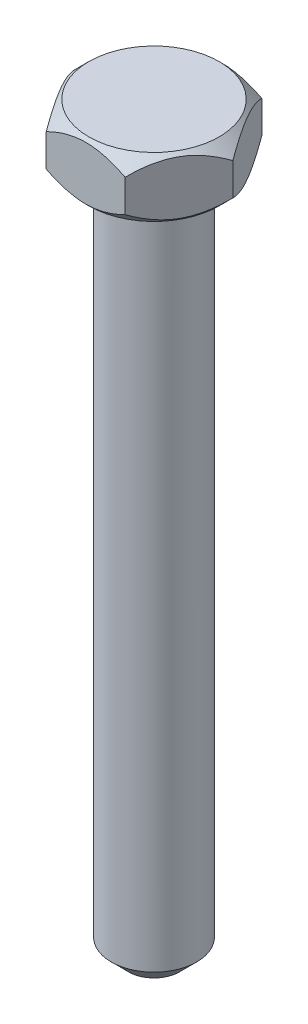
ISO-10303-21;
HEADER;
FILE_DESCRIPTION(('STEP AP214'),'2;1');
FILE_NAME('part.step','',(''),(''),'','','');
FILE_SCHEMA(('AUTOMOTIVE_DESIGN { 1 0 10303 214 1 1 1 1 }'));
ENDSEC;
DATA;
#1=APPLICATION_CONTEXT('core data for automotive mechanical design processes');
#2=APPLICATION_PROTOCOL_DEFINITION('international standard','automotive_design',2000,#1);
#3=PRODUCT_CONTEXT('',#1,'mechanical');
#4=PRODUCT('Part','Part','',(#3));
#5=PRODUCT_RELATED_PRODUCT_CATEGORY('part','',(#4));
#6=PRODUCT_DEFINITION_FORMATION('','',#4);
#7=PRODUCT_DEFINITION_CONTEXT('part definition',#1,'design');
#8=PRODUCT_DEFINITION('design','',#6,#7);
#9=PRODUCT_DEFINITION_SHAPE('','',#8);
#10=(LENGTH_UNIT() NAMED_UNIT(*) SI_UNIT(.MILLI.,.METRE.));
#11=(NAMED_UNIT(*) PLANE_ANGLE_UNIT() SI_UNIT($,.RADIAN.));
#12=(NAMED_UNIT(*) SI_UNIT($,.STERADIAN.) SOLID_ANGLE_UNIT());
#13=UNCERTAINTY_MEASURE_WITH_UNIT(LENGTH_MEASURE(1.E-05),#10,'distance_accuracy_value','');
#14=(GEOMETRIC_REPRESENTATION_CONTEXT(3) GLOBAL_UNCERTAINTY_ASSIGNED_CONTEXT((#13)) GLOBAL_UNIT_ASSIGNED_CONTEXT((#10,
#11,#12)) REPRESENTATION_CONTEXT('',''));
#15=CARTESIAN_POINT('',(0.,0.,0.));
#16=DIRECTION('',(0.,0.,1.));
#17=DIRECTION('',(1.,0.,0.));
#18=AXIS2_PLACEMENT_3D('',#15,#16,#17);
#19=CARTESIAN_POINT('',(-4.61880215351701,-3.5,0.));
#20=DIRECTION('',(0.,1.,0.));
#21=DIRECTION('',(0.,0.,1.));
#22=AXIS2_PLACEMENT_3D('',#19,#20,#21);
#23=PLANE('',#22);
#24=CARTESIAN_POINT('',(0.,-3.5,0.));
#25=DIRECTION('',(0.,1.,0.));
#26=DIRECTION('',(0.,0.,1.));
#27=AXIS2_PLACEMENT_3D('',#24,#25,#26);
#28=CIRCLE('',#27,3.81880215351701);
#29=CARTESIAN_POINT('',(0.,-3.5,3.81880215351701));
#30=VERTEX_POINT('',#29);
#31=EDGE_CURVE('E102',#30,#30,#28,.T.);
#32=ORIENTED_EDGE('',*,*,#31,.F.);
#33=EDGE_LOOP('',(#32));
#34=FACE_BOUND('',#33,.T.);
#35=CARTESIAN_POINT('',(0.,-3.5,0.));
#36=DIRECTION('',(0.,1.,0.));
#37=DIRECTION('',(0.,0.,1.));
#38=AXIS2_PLACEMENT_3D('',#35,#36,#37);
#39=CIRCLE('',#38,2.5);
#40=CARTESIAN_POINT('',(0.,-3.5,2.5));
#41=VERTEX_POINT('',#40);
#42=EDGE_CURVE('E117',#41,#41,#39,.F.);
#43=ORIENTED_EDGE('',*,*,#42,.F.);
#44=EDGE_LOOP('',(#43));
#45=FACE_BOUND('',#44,.T.);
#46=ADVANCED_FACE('F29',(#34,#45),#23,.F.);
#47=CARTESIAN_POINT('',(0.,-43.5,0.));
#48=DIRECTION('',(0.,1.,0.));
#49=DIRECTION('',(0.,0.,1.));
#50=AXIS2_PLACEMENT_3D('',#47,#48,#49);
#51=CYLINDRICAL_SURFACE('',#50,2.5);
#52=CARTESIAN_POINT('',(0.,-42.5,0.));
#53=DIRECTION('',(0.,-1.,0.));
#54=DIRECTION('',(0.,0.,-1.));
#55=AXIS2_PLACEMENT_3D('',#52,#53,#54);
#56=CIRCLE('',#55,2.5);
#57=CARTESIAN_POINT('',(0.,-42.5,-2.5));
#58=VERTEX_POINT('',#57);
#59=EDGE_CURVE('E42',#58,#58,#56,.F.);
#60=ORIENTED_EDGE('',*,*,#59,.T.);
#61=EDGE_LOOP('',(#60));
#62=FACE_BOUND('',#61,.T.);
#63=ORIENTED_EDGE('',*,*,#42,.T.);
#64=EDGE_LOOP('',(#63));
#65=FACE_BOUND('',#64,.T.);
#66=ADVANCED_FACE('F126',(#62,#65),#51,.T.);
#67=CARTESIAN_POINT('',(0.,-43.5,0.));
#68=DIRECTION('',(0.,-1.,0.));
#69=DIRECTION('',(0.,0.,-1.));
#70=AXIS2_PLACEMENT_3D('',#67,#68,#69);
#71=PLANE('',#70);
#72=CARTESIAN_POINT('',(0.,-43.5,0.));
#73=DIRECTION('',(0.,-1.,0.));
#74=DIRECTION('',(0.,0.,-1.));
#75=AXIS2_PLACEMENT_3D('',#72,#73,#74);
#76=CIRCLE('',#75,1.5);
#77=CARTESIAN_POINT('',(0.,-43.5,-1.5));
#78=VERTEX_POINT('',#77);
#79=EDGE_CURVE('E120',#78,#78,#76,.T.);
#80=ORIENTED_EDGE('',*,*,#79,.T.);
#81=EDGE_LOOP('',(#80));
#82=FACE_BOUND('',#81,.T.);
#83=ADVANCED_FACE('F132',(#82),#71,.T.);
#84=CARTESIAN_POINT('',(0.,-43.5,0.));
#85=DIRECTION('',(0.,1.,0.));
#86=DIRECTION('',(0.,0.,1.));
#87=AXIS2_PLACEMENT_3D('',#84,#85,#86);
#88=CONICAL_SURFACE('',#87,1.5,0.785398163397444);
#89=ORIENTED_EDGE('',*,*,#59,.F.);
#90=EDGE_LOOP('',(#89));
#91=FACE_BOUND('',#90,.T.);
#92=ORIENTED_EDGE('',*,*,#79,.F.);
#93=EDGE_LOOP('',(#92));
#94=FACE_BOUND('',#93,.T.);
#95=ADVANCED_FACE('F129',(#91,#94),#88,.T.);
#96=CARTESIAN_POINT('',(0.,-3.5,0.));
#97=DIRECTION('',(0.,1.,0.));
#98=DIRECTION('',(0.,0.,1.));
#99=AXIS2_PLACEMENT_3D('',#96,#97,#98);
#100=CONICAL_SURFACE('',#99,3.81880215351701,0.785398163397448);
#101=CARTESIAN_POINT('',(-4.61891762357085,-2.69988452561614,0.000200000000027756));
#102=CARTESIAN_POINT('',(-4.57920690352857,-2.73959114404244,-0.068580984718356));
#103=CARTESIAN_POINT('',(-4.53919230356692,-2.77807958288685,-0.137888304896475));
#104=CARTESIAN_POINT('',(-4.45849274714728,-2.8522487762645,-0.277664036763568));
#105=CARTESIAN_POINT('',(-4.41780743901014,-2.88792799726836,-0.348133057578679));
#106=CARTESIAN_POINT('',(-4.29427352009149,-2.99049913234901,-0.562100081603879));
#107=CARTESIAN_POINT('',(-4.21037499527408,-3.05248688898744,-0.707416589267722));
#108=CARTESIAN_POINT('',(-4.04121970302445,-3.1586441309906,-1.00040214981323));
#109=CARTESIAN_POINT('',(-3.95600566300933,-3.20308094454657,-1.14799719663762));
#110=CARTESIAN_POINT('',(-3.78369592639709,-3.27155101787056,-1.44644641508885));
#111=CARTESIAN_POINT('',(-3.6966055069617,-3.29563536213871,-1.59729144640342));
#112=CARTESIAN_POINT('',(-3.54650860589272,-3.31736511913948,-1.85726690511355));
#113=CARTESIAN_POINT('',(-3.48369550790706,-3.32058108535916,-1.96606238220551));
#114=CARTESIAN_POINT('',(-3.35817126167379,-3.31515994177501,-2.18347675426331));
#115=CARTESIAN_POINT('',(-3.29546015687919,-3.30651867682818,-2.29209557396634));
#116=CARTESIAN_POINT('',(-3.17063214810082,-3.27787596150358,-2.50830402737814));
#117=CARTESIAN_POINT('',(-3.10851598784037,-3.25786180544875,-2.61589237292032));
#118=CARTESIAN_POINT('',(-2.98535047827865,-3.20756584263536,-2.82922129322133));
#119=CARTESIAN_POINT('',(-2.92430104755975,-3.17728482312165,-2.93496200899963));
#120=CARTESIAN_POINT('',(-2.81592361944285,-3.11498474730579,-3.12267722089175));
#121=CARTESIAN_POINT('',(-2.76835567444983,-3.08460372013991,-3.2050673184313));
#122=CARTESIAN_POINT('',(-2.67407371522763,-3.01894553543967,-3.36836846204128));
#123=CARTESIAN_POINT('',(-2.6273597270248,-2.98366822896023,-3.44927946303275));
#124=CARTESIAN_POINT('',(-2.53493285809128,-2.90900831297909,-3.60936749601013));
#125=CARTESIAN_POINT('',(-2.48921734857499,-2.86963861299641,-3.68854908118623));
#126=CARTESIAN_POINT('',(-2.39863292742736,-2.78731089185671,-3.84544590098815));
#127=CARTESIAN_POINT('',(-2.35376351682289,-2.74435507219806,-3.92316199986076));
#128=CARTESIAN_POINT('',(-2.30928560670467,-2.69988452561615,-4.0002));
#129=B_SPLINE_CURVE_WITH_KNOTS('',3,(#101,#102,#103,#104,#105,#106,#107,#108,#109,#110,#111,
#112,#113,#114,#115,#116,#117,#118,#119,#120,#121,#122,#123,#124,#125,#126,#127,#128),
.UNSPECIFIED.,.F.,.F.,(4,2,2,2,2,2,2,2,2,2,2,2,2,4),(0.,0.266361961703665,0.532868334400115,
1.06875865685463,1.59613884594052,2.12219135055581,2.49866160599659,2.87526382203495,
3.25228760372077,3.62928248242858,3.92874944437162,4.22822551811347,4.52678401907576,
4.82516056577924),.UNSPECIFIED.);
#130=CARTESIAN_POINT('',(-4.61880215351702,-2.7,0.));
#131=VERTEX_POINT('',#130);
#132=CARTESIAN_POINT('',(-2.30940107675852,-2.7,-4.));
#133=VERTEX_POINT('',#132);
#134=EDGE_CURVE('E177',#131,#133,#129,.T.);
#135=ORIENTED_EDGE('',*,*,#134,.T.);
#136=CARTESIAN_POINT('',(-4.74669494328341,-1.11145868915222,-4.));
#137=CARTESIAN_POINT('',(-4.63173073558873,-1.1993508654303,-4.));
#138=CARTESIAN_POINT('',(-4.51613887537967,-1.28643511858206,-4.));
#139=CARTESIAN_POINT('',(-4.28344630120931,-1.45862113364621,-4.));
#140=CARTESIAN_POINT('',(-4.16634522978712,-1.54372241196675,-4.));
#141=CARTESIAN_POINT('',(-3.92952428886011,-1.71218153620796,-4.));
#142=CARTESIAN_POINT('',(-3.80979117395059,-1.79552082328341,-4.));
#143=CARTESIAN_POINT('',(-3.56831834415258,-1.95922999490112,-4.));
#144=CARTESIAN_POINT('',(-3.44657876940923,-2.03960008557233,-4.));
#145=CARTESIAN_POINT('',(-3.19323146896135,-2.20151222850148,-4.));
#146=CARTESIAN_POINT('',(-3.06147610302173,-2.28282442900108,-4.));
#147=CARTESIAN_POINT('',(-2.79487655444763,-2.44030225958758,-4.));
#148=CARTESIAN_POINT('',(-2.6600318671341,-2.51646704063563,-4.));
#149=CARTESIAN_POINT('',(-2.38723344772492,-2.66202065614541,-4.));
#150=CARTESIAN_POINT('',(-2.24929042181595,-2.73142939927244,-4.));
#151=CARTESIAN_POINT('',(-1.96955020070889,-2.86191616592764,-4.));
#152=CARTESIAN_POINT('',(-1.82775483658784,-2.92299806703933,-4.));
#153=CARTESIAN_POINT('',(-1.55337254847197,-3.02945404139103,-4.));
#154=CARTESIAN_POINT('',(-1.4211506740557,-3.07575938281105,-4.));
#155=CARTESIAN_POINT('',(-1.153400475509,-3.15777962167409,-4.));
#156=CARTESIAN_POINT('',(-1.01787193595579,-3.19349382712074,-4.));
#157=CARTESIAN_POINT('',(-0.746641513502644,-3.25182748471192,-4.));
#158=CARTESIAN_POINT('',(-0.610990636137922,-3.27468015045871,-4.));
#159=CARTESIAN_POINT('',(-0.338082766934168,-3.30682458453426,-4.));
#160=CARTESIAN_POINT('',(-0.200826093272512,-3.31611899495528,-4.));
#161=CARTESIAN_POINT('',(0.0682725110831627,-3.32038918600646,-4.));
#162=CARTESIAN_POINT('',(0.200105501326917,-3.31593690851227,-4.));
#163=CARTESIAN_POINT('',(0.462709681486531,-3.29425661019797,-4.));
#164=CARTESIAN_POINT('',(0.593480771402084,-3.27702739994749,-4.));
#165=CARTESIAN_POINT('',(0.855228740743153,-3.23046292068837,-4.));
#166=CARTESIAN_POINT('',(0.986167438767936,-3.20091656435704,-4.));
#167=CARTESIAN_POINT('',(1.24517252052895,-3.13133537173076,-4.));
#168=CARTESIAN_POINT('',(1.37323909358621,-3.09130122897531,-4.));
#169=CARTESIAN_POINT('',(1.6350146777751,-2.99940176499948,-4.));
#170=CARTESIAN_POINT('',(1.76850120421469,-2.94690960373252,-4.));
#171=CARTESIAN_POINT('',(2.03203083305245,-2.83383048639002,-4.));
#172=CARTESIAN_POINT('',(2.16207233412168,-2.77323984239489,-4.));
#173=CARTESIAN_POINT('',(2.41933252641898,-2.64540192173417,-4.));
#174=CARTESIAN_POINT('',(2.54654088208384,-2.57813401413965,-4.));
#175=CARTESIAN_POINT('',(2.79803896567839,-2.43842389721416,-4.));
#176=CARTESIAN_POINT('',(2.9223291435755,-2.36598249266423,-4.));
#177=CARTESIAN_POINT('',(3.16228713945874,-2.22062527401129,-4.));
#178=CARTESIAN_POINT('',(3.27807727928803,-2.14791032425798,-4.));
#179=CARTESIAN_POINT('',(3.5076685919422,-1.99939622591037,-4.));
#180=CARTESIAN_POINT('',(3.62146961421383,-1.92359684529293,-4.));
#181=CARTESIAN_POINT('',(3.84642549416774,-1.77008416558951,-4.));
#182=CARTESIAN_POINT('',(3.95759428564676,-1.69239121161213,-4.));
#183=CARTESIAN_POINT('',(4.17840845706007,-1.53493086471948,-4.));
#184=CARTESIAN_POINT('',(4.28805424827146,-1.4551640492307,-4.));
#185=CARTESIAN_POINT('',(4.39706149639085,-1.37454864251642,-4.));
#186=B_SPLINE_CURVE_WITH_KNOTS('',3,(#136,#137,#138,#139,#140,#141,#142,#143,#144,#145,#146,
#147,#148,#149,#150,#151,#152,#153,#154,#155,#156,#157,#158,#159,#160,#161,#162,#163,#164,#165,
#166,#167,#168,#169,#170,#171,#172,#173,#174,#175,#176,#177,#178,#179,#180,#181,#182,#183,#184,
#185),.UNSPECIFIED.,.F.,.F.,(4,2,2,2,2,2,2,2,2,2,2,2,2,2,2,2,2,2,2,2,2,2,2,2,4),(0.,
0.434146668569334,0.868398128074756,1.30600593465858,1.74358330412151,2.20796839055966,
2.672429888782,3.13547841811301,3.59831057635038,4.01823322720891,4.43818330864351,
4.85025065344053,5.26223768809276,5.65731799923051,6.05243509380702,6.45462166461373,
6.85678164621651,7.28676033389218,7.71693549838636,8.1484838030882,8.57996512242888,
8.9900948031474,9.4002553926905,9.80711077786197,10.2138540702172),.UNSPECIFIED.);
#187=CARTESIAN_POINT('',(2.3094010767585,-2.7,-4.00000000000002));
#188=VERTEX_POINT('',#187);
#189=EDGE_CURVE('E171',#133,#188,#186,.T.);
#190=ORIENTED_EDGE('',*,*,#189,.T.);
#191=CARTESIAN_POINT('',(2.30928560670467,-2.69988452561615,-4.0002));
#192=CARTESIAN_POINT('',(2.34899632674695,-2.73959114404245,-3.93141901528162));
#193=CARTESIAN_POINT('',(2.3890109267086,-2.77807958288686,-3.8621116951035));
#194=CARTESIAN_POINT('',(2.46971048312824,-2.8522487762645,-3.72233596323641));
#195=CARTESIAN_POINT('',(2.51039579126538,-2.88792799726837,-3.6518669424213));
#196=CARTESIAN_POINT('',(2.63392971018403,-2.99049913234902,-3.4378999183961));
#197=CARTESIAN_POINT('',(2.71782823500144,-3.05248688898745,-3.29258341073225));
#198=CARTESIAN_POINT('',(2.88698352725107,-3.15864413099061,-2.99959785018675));
#199=CARTESIAN_POINT('',(2.97219756726618,-3.20308094454657,-2.85200280336236));
#200=CARTESIAN_POINT('',(3.14450730387843,-3.27155101787056,-2.55355358491113));
#201=CARTESIAN_POINT('',(3.23159772331381,-3.29563536213871,-2.40270855359656));
#202=CARTESIAN_POINT('',(3.3816946243828,-3.31736511913948,-2.14273309488644));
#203=CARTESIAN_POINT('',(3.44450772236846,-3.32058108535916,-2.03393761779447));
#204=CARTESIAN_POINT('',(3.57003196860172,-3.31515994177501,-1.81652324573667));
#205=CARTESIAN_POINT('',(3.63274307339633,-3.30651867682818,-1.70790442603365));
#206=CARTESIAN_POINT('',(3.7575710821747,-3.27787596150358,-1.49169597262185));
#207=CARTESIAN_POINT('',(3.81968724243514,-3.25786180544875,-1.38410762707967));
#208=CARTESIAN_POINT('',(3.94285275199687,-3.20756584263536,-1.17077870677866));
#209=CARTESIAN_POINT('',(4.00390218271577,-3.17728482312165,-1.06503799100036));
#210=CARTESIAN_POINT('',(4.11227961083267,-3.11498474730579,-0.877322779108241));
#211=CARTESIAN_POINT('',(4.15984755582569,-3.08460372013991,-0.794932681568691));
#212=CARTESIAN_POINT('',(4.25412951504789,-3.01894553543967,-0.631631537958703));
#213=CARTESIAN_POINT('',(4.30084350325072,-2.98366822896023,-0.550720536967234));
#214=CARTESIAN_POINT('',(4.39327037218424,-2.90900831297908,-0.39063250398986));
#215=CARTESIAN_POINT('',(4.43898588170053,-2.86963861299641,-0.311450918813753));
#216=CARTESIAN_POINT('',(4.52957030284816,-2.78731089185671,-0.154554099011833));
#217=CARTESIAN_POINT('',(4.57443971345263,-2.74435507219805,-0.0768380001392213));
#218=CARTESIAN_POINT('',(4.61891762357085,-2.69988452561614,0.000200000000015641));
#219=B_SPLINE_CURVE_WITH_KNOTS('',3,(#191,#192,#193,#194,#195,#196,#197,#198,#199,#200,#201,
#202,#203,#204,#205,#206,#207,#208,#209,#210,#211,#212,#213,#214,#215,#216,#217,#218),
.UNSPECIFIED.,.F.,.F.,(4,2,2,2,2,2,2,2,2,2,2,2,2,4),(0.,0.266361961703664,0.532868334400111,
1.06875865685462,1.5961388459405,2.1221913505558,2.49866160599657,2.87526382203494,
3.25228760372076,3.62928248242857,3.92874944437161,4.22822551811345,4.52678401907575,
4.82516056577923),.UNSPECIFIED.);
#220=CARTESIAN_POINT('',(4.61880215351701,-2.7,0.));
#221=VERTEX_POINT('',#220);
#222=EDGE_CURVE('E90',#188,#221,#219,.T.);
#223=ORIENTED_EDGE('',*,*,#222,.T.);
#224=CARTESIAN_POINT('',(4.61891762357085,-2.69988452561614,-0.000199999999985046));
#225=CARTESIAN_POINT('',(4.57920690352856,-2.73959114404244,0.0685809847183984));
#226=CARTESIAN_POINT('',(4.53919230356692,-2.77807958288685,0.137888304896517));
#227=CARTESIAN_POINT('',(4.45849274714727,-2.8522487762645,0.277664036763609));
#228=CARTESIAN_POINT('',(4.41780743901014,-2.88792799726836,0.34813305757872));
#229=CARTESIAN_POINT('',(4.29427352009149,-2.99049913234901,0.562100081603918));
#230=CARTESIAN_POINT('',(4.21037499527407,-3.05248688898745,0.707416589267761));
#231=CARTESIAN_POINT('',(4.04121970302444,-3.15864413099061,1.00040214981327));
#232=CARTESIAN_POINT('',(3.95600566300932,-3.20308094454657,1.14799719663766));
#233=CARTESIAN_POINT('',(3.78369592639707,-3.27155101787056,1.44644641508888));
#234=CARTESIAN_POINT('',(3.69660550696169,-3.29563536213871,1.59729144640345));
#235=CARTESIAN_POINT('',(3.5465086058927,-3.31736511913948,1.85726690511358));
#236=CARTESIAN_POINT('',(3.48369550790704,-3.32058108535916,1.96606238220554));
#237=CARTESIAN_POINT('',(3.35817126167377,-3.31515994177501,2.18347675426334));
#238=CARTESIAN_POINT('',(3.29546015687917,-3.30651867682818,2.29209557396637));
#239=CARTESIAN_POINT('',(3.1706321481008,-3.27787596150358,2.50830402737817));
#240=CARTESIAN_POINT('',(3.10851598784035,-3.25786180544875,2.61589237292034));
#241=CARTESIAN_POINT('',(2.98535047827863,-3.20756584263536,2.82922129322135));
#242=CARTESIAN_POINT('',(2.92430104755973,-3.17728482312165,2.93496200899965));
#243=CARTESIAN_POINT('',(2.81592361944282,-3.11498474730579,3.12267722089177));
#244=CARTESIAN_POINT('',(2.76835567444981,-3.08460372013991,3.20506731843132));
#245=CARTESIAN_POINT('',(2.67407371522761,-3.01894553543968,3.3683684620413));
#246=CARTESIAN_POINT('',(2.62735972702478,-2.98366822896024,3.44927946303277));
#247=CARTESIAN_POINT('',(2.53493285809126,-2.90900831297909,3.60936749601014));
#248=CARTESIAN_POINT('',(2.48921734857497,-2.86963861299642,3.68854908118624));
#249=CARTESIAN_POINT('',(2.39863292742734,-2.78731089185672,3.84544590098816));
#250=CARTESIAN_POINT('',(2.35376351682287,-2.74435507219807,3.92316199986077));
#251=CARTESIAN_POINT('',(2.30928560670465,-2.69988452561616,4.0002));
#252=B_SPLINE_CURVE_WITH_KNOTS('',3,(#224,#225,#226,#227,#228,#229,#230,#231,#232,#233,#234,
#235,#236,#237,#238,#239,#240,#241,#242,#243,#244,#245,#246,#247,#248,#249,#250,#251),
.UNSPECIFIED.,.F.,.F.,(4,2,2,2,2,2,2,2,2,2,2,2,2,4),(0.,0.266361961703665,0.532868334400114,
1.06875865685463,1.59613884594051,2.12219135055581,2.49866160599659,2.87526382203495,
3.25228760372077,3.62928248242858,3.92874944437161,4.22822551811345,4.52678401907573,
4.82516056577921),.UNSPECIFIED.);
#253=CARTESIAN_POINT('',(2.30940107675852,-2.7,4.));
#254=VERTEX_POINT('',#253);
#255=EDGE_CURVE('E86',#221,#254,#252,.T.);
#256=ORIENTED_EDGE('',*,*,#255,.T.);
#257=CARTESIAN_POINT('',(-4.74669494331183,-1.11145868913049,4.));
#258=CARTESIAN_POINT('',(-4.63173073561633,-1.19935086540941,4.));
#259=CARTESIAN_POINT('',(-4.51613887540645,-1.28643511856201,4.));
#260=CARTESIAN_POINT('',(-4.28344630123446,-1.45862113362783,4.));
#261=CARTESIAN_POINT('',(-4.16634522981144,-1.5437224119492,4.));
#262=CARTESIAN_POINT('',(-3.92952428888276,-1.71218153619209,4.));
#263=CARTESIAN_POINT('',(-3.80979117397239,-1.79552082326838,4.));
#264=CARTESIAN_POINT('',(-3.56831834417267,-1.95922999488776,4.));
#265=CARTESIAN_POINT('',(-3.44657876942845,-2.03960008555979,4.));
#266=CARTESIAN_POINT('',(-3.1932314689787,-2.20151222849066,4.));
#267=CARTESIAN_POINT('',(-3.06147610303807,-2.28282442899116,4.));
#268=CARTESIAN_POINT('',(-2.79487655446192,-2.4403022595794,4.));
#269=CARTESIAN_POINT('',(-2.66003186714736,-2.51646704062831,4.));
#270=CARTESIAN_POINT('',(-2.38723344773605,-2.66202065613972,4.));
#271=CARTESIAN_POINT('',(-2.24929042182601,-2.73142939926754,4.));
#272=CARTESIAN_POINT('',(-1.96955020071673,-2.8619161659242,4.));
#273=CARTESIAN_POINT('',(-1.82775483659454,-2.92299806703658,4.));
#274=CARTESIAN_POINT('',(-1.55337254847819,-3.02945404138876,4.));
#275=CARTESIAN_POINT('',(-1.42115067406264,-3.07575938280871,4.));
#276=CARTESIAN_POINT('',(-1.15340047551737,-3.15777962167175,4.));
#277=CARTESIAN_POINT('',(-1.0178719359649,-3.19349382711846,4.));
#278=CARTESIAN_POINT('',(-0.7466415135132,-3.25182748470995,4.));
#279=CARTESIAN_POINT('',(-0.610990636149189,-3.27468015045698,4.));
#280=CARTESIAN_POINT('',(-0.338082766946836,-3.30682458453317,4.));
#281=CARTESIAN_POINT('',(-0.200826093285872,-3.31611899495459,4.));
#282=CARTESIAN_POINT('',(0.0682725110685937,-3.32038918600669,4.));
#283=CARTESIAN_POINT('',(0.200105501311828,-3.31593690851301,4.));
#284=CARTESIAN_POINT('',(0.462709681470457,-3.29425661019981,4.));
#285=CARTESIAN_POINT('',(0.593480771385546,-3.27702739994991,4.));
#286=CARTESIAN_POINT('',(0.855228740725698,-3.230462920692,4.));
#287=CARTESIAN_POINT('',(0.986167438750031,-3.20091656436132,4.));
#288=CARTESIAN_POINT('',(1.24517252051019,-3.13133537173633,4.));
#289=CARTESIAN_POINT('',(1.37323909356705,-3.09130122898153,4.));
#290=CARTESIAN_POINT('',(1.63501467775369,-2.99940176500754,4.));
#291=CARTESIAN_POINT('',(1.76850120419148,-2.94690960374188,4.));
#292=CARTESIAN_POINT('',(2.03203083302572,-2.8338304864021,4.));
#293=CARTESIAN_POINT('',(2.16207233409324,-2.77323984240839,4.));
#294=CARTESIAN_POINT('',(2.41933252638718,-2.6454019217506,4.));
#295=CARTESIAN_POINT('',(2.54654088205039,-2.5781340141576,4.));
#296=CARTESIAN_POINT('',(2.79803896564169,-2.43842389723518,4.));
#297=CARTESIAN_POINT('',(2.92232914353721,-2.3659824926868,4.));
#298=CARTESIAN_POINT('',(3.16228713941755,-2.22062527403683,4.));
#299=CARTESIAN_POINT('',(3.27807727924554,-2.14791032428491,4.));
#300=CARTESIAN_POINT('',(3.50766859189711,-1.99939622594009,4.));
#301=CARTESIAN_POINT('',(3.62146961416746,-1.92359684532405,4.));
#302=CARTESIAN_POINT('',(3.84642549411882,-1.77008416562341,4.));
#303=CARTESIAN_POINT('',(3.95759428559658,-1.69239121164742,4.));
#304=CARTESIAN_POINT('',(4.17840845700739,-1.53493086475754,4.));
#305=CARTESIAN_POINT('',(4.28805424821753,-1.45516404927014,4.));
#306=CARTESIAN_POINT('',(4.39706149633567,-1.37454864255723,4.));
#307=B_SPLINE_CURVE_WITH_KNOTS('',3,(#257,#258,#259,#260,#261,#262,#263,#264,#265,#266,#267,
#268,#269,#270,#271,#272,#273,#274,#275,#276,#277,#278,#279,#280,#281,#282,#283,#284,#285,#286,
#287,#288,#289,#290,#291,#292,#293,#294,#295,#296,#297,#298,#299,#300,#301,#302,#303,#304,#305,
#306),.UNSPECIFIED.,.F.,.F.,(4,2,2,2,2,2,2,2,2,2,2,2,2,2,2,2,2,2,2,2,2,2,2,2,4),(0.,
0.434146668572803,0.868398128081697,1.30600593466906,1.74358330413552,2.20796839057765,
2.67242988880396,3.13547841813892,3.59831057638022,4.01823322723668,4.43818330866922,
4.85025065346426,5.26223768811452,5.65731799925067,6.05243509382556,6.45462166463053,
6.85678164623158,7.2867603339008,7.71693549838852,8.14848380308387,8.57996512241806,
8.99009480313104,9.40025539266859,9.80711077783459,10.2138540701843),.UNSPECIFIED.);
#308=CARTESIAN_POINT('',(-2.30940107675848,-2.70000000000002,4.));
#309=VERTEX_POINT('',#308);
#310=EDGE_CURVE('E48',#254,#309,#307,.F.);
#311=ORIENTED_EDGE('',*,*,#310,.T.);
#312=CARTESIAN_POINT('',(-2.30928560670464,-2.69988452561616,4.0002));
#313=CARTESIAN_POINT('',(-2.34899632674693,-2.73959114404246,3.93141901528162));
#314=CARTESIAN_POINT('',(-2.38901092670858,-2.77807958288687,3.8621116951035));
#315=CARTESIAN_POINT('',(-2.46971048312822,-2.85224877626451,3.72233596323641));
#316=CARTESIAN_POINT('',(-2.51039579126535,-2.88792799726838,3.6518669424213));
#317=CARTESIAN_POINT('',(-2.633929710184,-2.99049913234903,3.43789991839611));
#318=CARTESIAN_POINT('',(-2.71782823500142,-3.05248688898745,3.29258341073227));
#319=CARTESIAN_POINT('',(-2.88698352725104,-3.15864413099061,2.99959785018676));
#320=CARTESIAN_POINT('',(-2.97219756726616,-3.20308094454658,2.85200280336238));
#321=CARTESIAN_POINT('',(-3.14450730387841,-3.27155101787057,2.55355358491116));
#322=CARTESIAN_POINT('',(-3.23159772331379,-3.29563536213871,2.40270855359659));
#323=CARTESIAN_POINT('',(-3.38169462438278,-3.31736511913948,2.14273309488647));
#324=CARTESIAN_POINT('',(-3.44450772236844,-3.32058108535916,2.0339376177945));
#325=CARTESIAN_POINT('',(-3.57003196860171,-3.31515994177501,1.81652324573671));
#326=CARTESIAN_POINT('',(-3.63274307339631,-3.30651867682818,1.70790442603368));
#327=CARTESIAN_POINT('',(-3.75757108217469,-3.27787596150358,1.49169597262188));
#328=CARTESIAN_POINT('',(-3.81968724243513,-3.25786180544875,1.3841076270797));
#329=CARTESIAN_POINT('',(-3.94285275199685,-3.20756584263536,1.1707787067787));
#330=CARTESIAN_POINT('',(-4.00390218271576,-3.17728482312165,1.0650379910004));
#331=CARTESIAN_POINT('',(-4.11227961083266,-3.11498474730579,0.877322779108279));
#332=CARTESIAN_POINT('',(-4.15984755582568,-3.08460372013991,0.794932681568729));
#333=CARTESIAN_POINT('',(-4.25412951504789,-3.01894553543967,0.631631537958742));
#334=CARTESIAN_POINT('',(-4.30084350325071,-2.98366822896023,0.550720536967273));
#335=CARTESIAN_POINT('',(-4.39327037218424,-2.90900831297908,0.3906325039899));
#336=CARTESIAN_POINT('',(-4.43898588170053,-2.86963861299641,0.311450918813793));
#337=CARTESIAN_POINT('',(-4.52957030284816,-2.78731089185671,0.154554099011874));
#338=CARTESIAN_POINT('',(-4.57443971345263,-2.74435507219805,0.0768380001392636));
#339=CARTESIAN_POINT('',(-4.61891762357085,-2.69988452561614,-0.000199999999972631));
#340=B_SPLINE_CURVE_WITH_KNOTS('',3,(#312,#313,#314,#315,#316,#317,#318,#319,#320,#321,#322,
#323,#324,#325,#326,#327,#328,#329,#330,#331,#332,#333,#334,#335,#336,#337,#338,#339),
.UNSPECIFIED.,.F.,.F.,(4,2,2,2,2,2,2,2,2,2,2,2,2,4),(0.,0.26636196170366,0.532868334400105,
1.06875865685461,1.59613884594049,2.12219135055577,2.49866160599655,2.87526382203491,
3.25228760372073,3.62928248242854,3.92874944437158,4.22822551811343,4.52678401907572,
4.82516056577921),.UNSPECIFIED.);
#341=EDGE_CURVE('E11',#309,#131,#340,.T.);
#342=ORIENTED_EDGE('',*,*,#341,.T.);
#343=EDGE_LOOP('',(#135,#190,#223,#256,#311,#342));
#344=FACE_BOUND('',#343,.T.);
#345=ORIENTED_EDGE('',*,*,#31,.T.);
#346=EDGE_LOOP('',(#345));
#347=FACE_BOUND('',#346,.T.);
#348=ADVANCED_FACE('F87',(#344,#347),#100,.T.);
#349=CARTESIAN_POINT('',(-4.61880215351701,0.,0.));
#350=DIRECTION('',(0.,1.,0.));
#351=DIRECTION('',(0.,0.,1.));
#352=AXIS2_PLACEMENT_3D('',#349,#350,#351);
#353=PLANE('',#352);
#354=CARTESIAN_POINT('',(0.,0.,0.));
#355=DIRECTION('',(0.,1.,0.));
#356=DIRECTION('',(0.,0.,1.));
#357=AXIS2_PLACEMENT_3D('',#354,#355,#356);
#358=CIRCLE('',#357,3.81880215351701);
#359=CARTESIAN_POINT('',(0.,0.,3.81880215351701));
#360=VERTEX_POINT('',#359);
#361=EDGE_CURVE('E234',#360,#360,#358,.T.);
#362=ORIENTED_EDGE('',*,*,#361,.T.);
#363=EDGE_LOOP('',(#362));
#364=FACE_BOUND('',#363,.T.);
#365=ADVANCED_FACE('F152',(#364),#353,.T.);
#366=CARTESIAN_POINT('',(0.,-0.8,0.));
#367=DIRECTION('',(0.,-1.,0.));
#368=DIRECTION('',(0.,0.,-1.));
#369=AXIS2_PLACEMENT_3D('',#366,#367,#368);
#370=CONICAL_SURFACE('',#369,4.61880215351701,0.785398163397448);
#371=CARTESIAN_POINT('',(-2.30928560670467,-0.80011547438385,-4.0002));
#372=CARTESIAN_POINT('',(-2.34899632674696,-0.76040885595755,-3.93141901528162));
#373=CARTESIAN_POINT('',(-2.3890109267086,-0.721920417113141,-3.8621116951035));
#374=CARTESIAN_POINT('',(-2.46971048312825,-0.647751223735498,-3.72233596323641));
#375=CARTESIAN_POINT('',(-2.51039579126538,-0.612072002731633,-3.65186694242129));
#376=CARTESIAN_POINT('',(-2.63392971018403,-0.509500867650983,-3.4378999183961));
#377=CARTESIAN_POINT('',(-2.71782823500145,-0.447513111012552,-3.29258341073225));
#378=CARTESIAN_POINT('',(-2.88698352725107,-0.341355869009392,-2.99959785018674));
#379=CARTESIAN_POINT('',(-2.97219756726619,-0.296919055453425,-2.85200280336235));
#380=CARTESIAN_POINT('',(-3.14450730387843,-0.228448982129436,-2.55355358491113));
#381=CARTESIAN_POINT('',(-3.23159772331382,-0.204364637861294,-2.40270855359656));
#382=CARTESIAN_POINT('',(-3.3816946243828,-0.182634880860519,-2.14273309488643));
#383=CARTESIAN_POINT('',(-3.44450772236846,-0.179418914640843,-2.03393761779447));
#384=CARTESIAN_POINT('',(-3.57003196860173,-0.184840058224988,-1.81652324573667));
#385=CARTESIAN_POINT('',(-3.63274307339633,-0.193481323171816,-1.70790442603364));
#386=CARTESIAN_POINT('',(-3.7575710821747,-0.222124038496419,-1.49169597262184));
#387=CARTESIAN_POINT('',(-3.81968724243515,-0.24213819455125,-1.38410762707966));
#388=CARTESIAN_POINT('',(-3.94285275199687,-0.292434157364639,-1.17077870677865));
#389=CARTESIAN_POINT('',(-4.00390218271577,-0.322715176878353,-1.06503799100035));
#390=CARTESIAN_POINT('',(-4.11227961083267,-0.385015252694212,-0.877322779108234));
#391=CARTESIAN_POINT('',(-4.15984755582569,-0.415396279860092,-0.794932681568683));
#392=CARTESIAN_POINT('',(-4.25412951504789,-0.481054464560328,-0.631631537958694));
#393=CARTESIAN_POINT('',(-4.30084350325072,-0.516331771039769,-0.550720536967224));
#394=CARTESIAN_POINT('',(-4.39327037218424,-0.590991687020916,-0.390632503989849));
#395=CARTESIAN_POINT('',(-4.43898588170053,-0.630361387003592,-0.311450918813742));
#396=CARTESIAN_POINT('',(-4.52957030284816,-0.712689108143292,-0.154554099011821));
#397=CARTESIAN_POINT('',(-4.57443971345263,-0.75564492780195,-0.0768380001392092));
#398=CARTESIAN_POINT('',(-4.61891762357085,-0.800115474383857,0.00020000000002798));
#399=B_SPLINE_CURVE_WITH_KNOTS('',3,(#371,#372,#373,#374,#375,#376,#377,#378,#379,#380,#381,
#382,#383,#384,#385,#386,#387,#388,#389,#390,#391,#392,#393,#394,#395,#396,#397,#398),
.UNSPECIFIED.,.F.,.F.,(4,2,2,2,2,2,2,2,2,2,2,2,2,4),(0.,0.266361961703663,0.532868334400112,
1.06875865685462,1.59613884594051,2.1221913505558,2.49866160599658,2.87526382203494,
3.25228760372076,3.62928248242857,3.92874944437161,4.22822551811346,4.52678401907576,
4.82516056577924),.UNSPECIFIED.);
#400=CARTESIAN_POINT('',(-2.30940107675852,-0.8,-4.));
#401=VERTEX_POINT('',#400);
#402=CARTESIAN_POINT('',(-4.61880215351701,-0.8,0.));
#403=VERTEX_POINT('',#402);
#404=EDGE_CURVE('E116',#401,#403,#399,.T.);
#405=ORIENTED_EDGE('',*,*,#404,.T.);
#406=CARTESIAN_POINT('',(-4.61891762357085,-0.800115474383857,-0.000199999999972244));
#407=CARTESIAN_POINT('',(-4.57920690352857,-0.760408855957556,0.0685809847184112));
#408=CARTESIAN_POINT('',(-4.53919230356692,-0.721920417113147,0.137888304896529));
#409=CARTESIAN_POINT('',(-4.45849274714727,-0.647751223735503,0.277664036763622));
#410=CARTESIAN_POINT('',(-4.41780743901014,-0.612072002731638,0.348133057578733));
#411=CARTESIAN_POINT('',(-4.29427352009148,-0.509500867650987,0.562100081603931));
#412=CARTESIAN_POINT('',(-4.21037499527407,-0.447513111012555,0.707416589267774));
#413=CARTESIAN_POINT('',(-4.04121970302444,-0.341355869009395,1.00040214981328));
#414=CARTESIAN_POINT('',(-3.95600566300932,-0.296919055453428,1.14799719663767));
#415=CARTESIAN_POINT('',(-3.78369592639707,-0.228448982129437,1.4464464150889));
#416=CARTESIAN_POINT('',(-3.69660550696168,-0.204364637861293,1.59729144640347));
#417=CARTESIAN_POINT('',(-3.54650860589269,-0.182634880860519,1.85726690511359));
#418=CARTESIAN_POINT('',(-3.48369550790703,-0.179418914640844,1.96606238220556));
#419=CARTESIAN_POINT('',(-3.35817126167376,-0.184840058224989,2.18347675426336));
#420=CARTESIAN_POINT('',(-3.29546015687916,-0.193481323171817,2.29209557396638));
#421=CARTESIAN_POINT('',(-3.17063214810078,-0.222124038496419,2.50830402737818));
#422=CARTESIAN_POINT('',(-3.10851598784034,-0.242138194551251,2.61589237292036));
#423=CARTESIAN_POINT('',(-2.98535047827862,-0.29243415736464,2.82922129322137));
#424=CARTESIAN_POINT('',(-2.92430104755971,-0.322715176878354,2.93496200899967));
#425=CARTESIAN_POINT('',(-2.81592361944281,-0.385015252694212,3.12267722089178));
#426=CARTESIAN_POINT('',(-2.76835567444979,-0.415396279860091,3.20506731843133));
#427=CARTESIAN_POINT('',(-2.67407371522759,-0.481054464560324,3.36836846204131));
#428=CARTESIAN_POINT('',(-2.62735972702477,-0.516331771039763,3.44927946303277));
#429=CARTESIAN_POINT('',(-2.53493285809125,-0.590991687020907,3.60936749601014));
#430=CARTESIAN_POINT('',(-2.48921734857496,-0.630361387003581,3.68854908118625));
#431=CARTESIAN_POINT('',(-2.39863292742733,-0.712689108143276,3.84544590098816));
#432=CARTESIAN_POINT('',(-2.35376351682286,-0.755644927801931,3.92316199986077));
#433=CARTESIAN_POINT('',(-2.30928560670464,-0.800115474383836,4.0002));
#434=B_SPLINE_CURVE_WITH_KNOTS('',3,(#406,#407,#408,#409,#410,#411,#412,#413,#414,#415,#416,
#417,#418,#419,#420,#421,#422,#423,#424,#425,#426,#427,#428,#429,#430,#431,#432,#433),
.UNSPECIFIED.,.F.,.F.,(4,2,2,2,2,2,2,2,2,2,2,2,2,4),(0.,0.266361961703666,0.532868334400115,
1.06875865685463,1.59613884594052,2.12219135055582,2.49866160599659,2.87526382203496,
3.25228760372078,3.62928248242859,3.92874944437162,4.22822551811345,4.52678401907573,
4.82516056577921),.UNSPECIFIED.);
#435=CARTESIAN_POINT('',(-2.30940107675846,-0.8,4.00000000000004));
#436=VERTEX_POINT('',#435);
#437=EDGE_CURVE('E237',#403,#436,#434,.T.);
#438=ORIENTED_EDGE('',*,*,#437,.T.);
#439=CARTESIAN_POINT('',(-4.74669494331183,-2.38854131086951,4.));
#440=CARTESIAN_POINT('',(-4.63173073561633,-2.30064913459059,4.));
#441=CARTESIAN_POINT('',(-4.51613887540645,-2.21356488143799,4.));
#442=CARTESIAN_POINT('',(-4.28344630123446,-2.04137886637217,4.));
#443=CARTESIAN_POINT('',(-4.16634522981144,-1.9562775880508,4.));
#444=CARTESIAN_POINT('',(-3.92952428888276,-1.78781846380791,4.));
#445=CARTESIAN_POINT('',(-3.80979117397239,-1.70447917673162,4.));
#446=CARTESIAN_POINT('',(-3.56831834417267,-1.54077000511224,4.));
#447=CARTESIAN_POINT('',(-3.44657876942845,-1.4603999144402,4.));
#448=CARTESIAN_POINT('',(-3.1932314689787,-1.29848777150934,4.));
#449=CARTESIAN_POINT('',(-3.06147610303807,-1.21717557100884,4.));
#450=CARTESIAN_POINT('',(-2.79487655446192,-1.0596977404206,4.));
#451=CARTESIAN_POINT('',(-2.66003186714736,-0.983532959371693,4.));
#452=CARTESIAN_POINT('',(-2.38723344773605,-0.83797934386028,4.));
#453=CARTESIAN_POINT('',(-2.24929042182601,-0.768570600732463,4.));
#454=CARTESIAN_POINT('',(-1.96955020071673,-0.638083834075798,4.));
#455=CARTESIAN_POINT('',(-1.82775483659454,-0.577001932963423,4.));
#456=CARTESIAN_POINT('',(-1.55337254847819,-0.470545958611243,4.));
#457=CARTESIAN_POINT('',(-1.42115067406264,-0.424240617191292,4.));
#458=CARTESIAN_POINT('',(-1.15340047551737,-0.342220378328252,4.));
#459=CARTESIAN_POINT('',(-1.0178719359649,-0.306506172881536,4.));
#460=CARTESIAN_POINT('',(-0.7466415135132,-0.248172515290046,4.));
#461=CARTESIAN_POINT('',(-0.610990636149189,-0.225319849543021,4.));
#462=CARTESIAN_POINT('',(-0.338082766946836,-0.193175415466834,4.));
#463=CARTESIAN_POINT('',(-0.200826093285872,-0.18388100504541,4.));
#464=CARTESIAN_POINT('',(0.0682725110685938,-0.179610813993308,4.));
#465=CARTESIAN_POINT('',(0.200105501311828,-0.184063091486993,4.));
#466=CARTESIAN_POINT('',(0.462709681470458,-0.205743389800194,4.));
#467=CARTESIAN_POINT('',(0.593480771385547,-0.222972600050089,4.));
#468=CARTESIAN_POINT('',(0.855228740725699,-0.269537079307995,4.));
#469=CARTESIAN_POINT('',(0.986167438750031,-0.299083435638683,4.));
#470=CARTESIAN_POINT('',(1.24517252051019,-0.368664628263667,4.));
#471=CARTESIAN_POINT('',(1.37323909356705,-0.40869877101847,4.));
#472=CARTESIAN_POINT('',(1.63501467775369,-0.500598234992463,4.));
#473=CARTESIAN_POINT('',(1.76850120419148,-0.553090396258124,4.));
#474=CARTESIAN_POINT('',(2.03203083302572,-0.666169513597902,4.));
#475=CARTESIAN_POINT('',(2.16207233409324,-0.72676015759161,4.));
#476=CARTESIAN_POINT('',(2.41933252638718,-0.854598078249394,4.));
#477=CARTESIAN_POINT('',(2.54654088205039,-0.921865985842403,4.));
#478=CARTESIAN_POINT('',(2.79803896564169,-1.06157610276482,4.));
#479=CARTESIAN_POINT('',(2.92232914353721,-1.1340175073132,4.));
#480=CARTESIAN_POINT('',(3.16228713941755,-1.27937472596317,4.));
#481=CARTESIAN_POINT('',(3.27807727924553,-1.35208967571509,4.));
#482=CARTESIAN_POINT('',(3.50766859189711,-1.5006037740599,4.));
#483=CARTESIAN_POINT('',(3.62146961416745,-1.57640315467594,4.));
#484=CARTESIAN_POINT('',(3.84642549411882,-1.72991583437659,4.));
#485=CARTESIAN_POINT('',(3.95759428559658,-1.80760878835258,4.));
#486=CARTESIAN_POINT('',(4.17840845700739,-1.96506913524246,4.));
#487=CARTESIAN_POINT('',(4.28805424821752,-2.04483595072986,4.));
#488=CARTESIAN_POINT('',(4.39706149633567,-2.12545135744276,4.));
#489=B_SPLINE_CURVE_WITH_KNOTS('',3,(#439,#440,#441,#442,#443,#444,#445,#446,#447,#448,#449,
#450,#451,#452,#453,#454,#455,#456,#457,#458,#459,#460,#461,#462,#463,#464,#465,#466,#467,#468,
#469,#470,#471,#472,#473,#474,#475,#476,#477,#478,#479,#480,#481,#482,#483,#484,#485,#486,#487,
#488),.UNSPECIFIED.,.F.,.F.,(4,2,2,2,2,2,2,2,2,2,2,2,2,2,2,2,2,2,2,2,2,2,2,2,4),(0.,
0.434146668572803,0.868398128081697,1.30600593466906,1.74358330413553,2.20796839057765,
2.67242988880397,3.13547841813892,3.59831057638022,4.01823322723668,4.43818330866922,
4.85025065346426,5.26223768811452,5.65731799925067,6.05243509382556,6.45462166463053,
6.85678164623157,7.2867603339008,7.71693549838852,8.14848380308387,8.57996512241806,
8.99009480313104,9.40025539266859,9.80711077783459,10.2138540701843),.UNSPECIFIED.);
#490=CARTESIAN_POINT('',(2.30940107675852,-0.8,4.));
#491=VERTEX_POINT('',#490);
#492=EDGE_CURVE('E211',#436,#491,#489,.T.);
#493=ORIENTED_EDGE('',*,*,#492,.T.);
#494=CARTESIAN_POINT('',(2.30928560670465,-0.80011547438384,4.0002));
#495=CARTESIAN_POINT('',(2.34899632674694,-0.760408855957541,3.93141901528162));
#496=CARTESIAN_POINT('',(2.38901092670859,-0.721920417113134,3.8621116951035));
#497=CARTESIAN_POINT('',(2.46971048312823,-0.647751223735491,3.72233596323641));
#498=CARTESIAN_POINT('',(2.51039579126536,-0.612072002731627,3.6518669424213));
#499=CARTESIAN_POINT('',(2.63392971018401,-0.509500867650978,3.4378999183961));
#500=CARTESIAN_POINT('',(2.71782823500143,-0.447513111012549,3.29258341073226));
#501=CARTESIAN_POINT('',(2.88698352725105,-0.341355869009391,2.99959785018676));
#502=CARTESIAN_POINT('',(2.97219756726617,-0.296919055453424,2.85200280336237));
#503=CARTESIAN_POINT('',(3.14450730387842,-0.228448982129436,2.55355358491115));
#504=CARTESIAN_POINT('',(3.2315977233138,-0.204364637861294,2.40270855359658));
#505=CARTESIAN_POINT('',(3.38169462438279,-0.18263488086052,2.14273309488646));
#506=CARTESIAN_POINT('',(3.44450772236845,-0.179418914640844,2.03393761779449));
#507=CARTESIAN_POINT('',(3.57003196860172,-0.18484005822499,1.81652324573669));
#508=CARTESIAN_POINT('',(3.63274307339632,-0.193481323171818,1.70790442603367));
#509=CARTESIAN_POINT('',(3.7575710821747,-0.22212403849642,1.49169597262187));
#510=CARTESIAN_POINT('',(3.81968724243514,-0.242138194551252,1.38410762707969));
#511=CARTESIAN_POINT('',(3.94285275199686,-0.292434157364641,1.17077870677868));
#512=CARTESIAN_POINT('',(4.00390218271576,-0.322715176878355,1.06503799100038));
#513=CARTESIAN_POINT('',(4.11227961083267,-0.385015252694214,0.877322779108265));
#514=CARTESIAN_POINT('',(4.15984755582569,-0.415396279860094,0.794932681568716));
#515=CARTESIAN_POINT('',(4.25412951504789,-0.48105446456033,0.631631537958729));
#516=CARTESIAN_POINT('',(4.30084350325072,-0.51633177103977,0.55072053696726));
#517=CARTESIAN_POINT('',(4.39327037218424,-0.590991687020917,0.390632503989887));
#518=CARTESIAN_POINT('',(4.43898588170053,-0.630361387003592,0.311450918813781));
#519=CARTESIAN_POINT('',(4.52957030284816,-0.712689108143291,0.154554099011862));
#520=CARTESIAN_POINT('',(4.57443971345263,-0.755644927801949,0.0768380001392509));
#521=CARTESIAN_POINT('',(4.61891762357085,-0.800115474383855,-0.000199999999985036));
#522=B_SPLINE_CURVE_WITH_KNOTS('',3,(#494,#495,#496,#497,#498,#499,#500,#501,#502,#503,#504,
#505,#506,#507,#508,#509,#510,#511,#512,#513,#514,#515,#516,#517,#518,#519,#520,#521),
.UNSPECIFIED.,.F.,.F.,(4,2,2,2,2,2,2,2,2,2,2,2,2,4),(0.,0.266361961703662,0.532868334400107,
1.06875865685461,1.59613884594049,2.12219135055578,2.49866160599656,2.87526382203492,
3.25228760372074,3.62928248242855,3.92874944437159,4.22822551811343,4.52678401907573,
4.82516056577921),.UNSPECIFIED.);
#523=CARTESIAN_POINT('',(4.61880215351701,-0.8,0.));
#524=VERTEX_POINT('',#523);
#525=EDGE_CURVE('E107',#491,#524,#522,.T.);
#526=ORIENTED_EDGE('',*,*,#525,.T.);
#527=CARTESIAN_POINT('',(4.61891762357085,-0.800115474383856,0.000200000000015093));
#528=CARTESIAN_POINT('',(4.57920690352857,-0.760408855957555,-0.0685809847183687));
#529=CARTESIAN_POINT('',(4.53919230356692,-0.721920417113146,-0.137888304896487));
#530=CARTESIAN_POINT('',(4.45849274714727,-0.647751223735502,-0.27766403676358));
#531=CARTESIAN_POINT('',(4.41780743901014,-0.612072002731637,-0.348133057578692));
#532=CARTESIAN_POINT('',(4.29427352009149,-0.509500867650986,-0.562100081603891));
#533=CARTESIAN_POINT('',(4.21037499527407,-0.447513111012554,-0.707416589267734));
#534=CARTESIAN_POINT('',(4.04121970302445,-0.341355869009394,-1.00040214981325));
#535=CARTESIAN_POINT('',(3.95600566300933,-0.296919055453427,-1.14799719663764));
#536=CARTESIAN_POINT('',(3.78369592639708,-0.228448982129437,-1.44644641508886));
#537=CARTESIAN_POINT('',(3.6966055069617,-0.204364637861294,-1.59729144640343));
#538=CARTESIAN_POINT('',(3.54650860589271,-0.182634880860519,-1.85726690511355));
#539=CARTESIAN_POINT('',(3.48369550790705,-0.179418914640843,-1.96606238220552));
#540=CARTESIAN_POINT('',(3.35817126167379,-0.184840058224988,-2.18347675426332));
#541=CARTESIAN_POINT('',(3.29546015687918,-0.193481323171817,-2.29209557396635));
#542=CARTESIAN_POINT('',(3.17063214810081,-0.22212403849642,-2.50830402737815));
#543=CARTESIAN_POINT('',(3.10851598784037,-0.242138194551251,-2.61589237292033));
#544=CARTESIAN_POINT('',(2.98535047827865,-0.29243415736464,-2.82922129322134));
#545=CARTESIAN_POINT('',(2.92430104755974,-0.322715176878354,-2.93496200899964));
#546=CARTESIAN_POINT('',(2.81592361944284,-0.385015252694213,-3.12267722089175));
#547=CARTESIAN_POINT('',(2.76835567444982,-0.415396279860092,-3.2050673184313));
#548=CARTESIAN_POINT('',(2.67407371522762,-0.481054464560327,-3.36836846204129));
#549=CARTESIAN_POINT('',(2.6273597270248,-0.516331771039767,-3.44927946303276));
#550=CARTESIAN_POINT('',(2.53493285809127,-0.590991687020913,-3.60936749601013));
#551=CARTESIAN_POINT('',(2.48921734857499,-0.630361387003588,-3.68854908118624));
#552=CARTESIAN_POINT('',(2.39863292742735,-0.712689108143285,-3.84544590098815));
#553=CARTESIAN_POINT('',(2.35376351682288,-0.755644927801942,-3.92316199986076));
#554=CARTESIAN_POINT('',(2.30928560670467,-0.800115474383848,-4.0002));
#555=B_SPLINE_CURVE_WITH_KNOTS('',3,(#527,#528,#529,#530,#531,#532,#533,#534,#535,#536,#537,
#538,#539,#540,#541,#542,#543,#544,#545,#546,#547,#548,#549,#550,#551,#552,#553,#554),
.UNSPECIFIED.,.F.,.F.,(4,2,2,2,2,2,2,2,2,2,2,2,2,4),(0.,0.266361961703666,0.532868334400115,
1.06875865685463,1.59613884594052,2.12219135055581,2.49866160599659,2.87526382203495,
3.25228760372077,3.62928248242858,3.92874944437162,4.22822551811346,4.52678401907575,
4.82516056577923),.UNSPECIFIED.);
#556=CARTESIAN_POINT('',(2.3094010767585,-0.8,-4.00000000000002));
#557=VERTEX_POINT('',#556);
#558=EDGE_CURVE('E210',#524,#557,#555,.T.);
#559=ORIENTED_EDGE('',*,*,#558,.T.);
#560=CARTESIAN_POINT('',(-4.74669494328341,-2.38854131084778,-4.));
#561=CARTESIAN_POINT('',(-4.63173073558873,-2.3006491345697,-4.));
#562=CARTESIAN_POINT('',(-4.51613887537967,-2.21356488141794,-4.));
#563=CARTESIAN_POINT('',(-4.28344630120931,-2.04137886635379,-4.));
#564=CARTESIAN_POINT('',(-4.16634522978711,-1.95627758803325,-4.));
#565=CARTESIAN_POINT('',(-3.92952428886011,-1.78781846379204,-4.));
#566=CARTESIAN_POINT('',(-3.80979117395059,-1.70447917671659,-4.));
#567=CARTESIAN_POINT('',(-3.56831834415258,-1.54077000509887,-4.));
#568=CARTESIAN_POINT('',(-3.44657876940923,-1.46039991442767,-4.));
#569=CARTESIAN_POINT('',(-3.19323146896135,-1.29848777149852,-4.));
#570=CARTESIAN_POINT('',(-3.06147610302173,-1.21717557099892,-4.));
#571=CARTESIAN_POINT('',(-2.79487655444763,-1.05969774041242,-4.));
#572=CARTESIAN_POINT('',(-2.6600318671341,-0.983532959364369,-4.));
#573=CARTESIAN_POINT('',(-2.38723344772492,-0.83797934385459,-4.));
#574=CARTESIAN_POINT('',(-2.24929042181595,-0.768570600727555,-4.));
#575=CARTESIAN_POINT('',(-1.96955020070889,-0.638083834072357,-4.));
#576=CARTESIAN_POINT('',(-1.82775483658784,-0.577001932960666,-4.));
#577=CARTESIAN_POINT('',(-1.55337254847197,-0.470545958608969,-4.));
#578=CARTESIAN_POINT('',(-1.4211506740557,-0.424240617188946,-4.));
#579=CARTESIAN_POINT('',(-1.153400475509,-0.342220378325906,-4.));
#580=CARTESIAN_POINT('',(-1.01787193595579,-0.306506172879262,-4.));
#581=CARTESIAN_POINT('',(-0.746641513502643,-0.248172515288083,-4.));
#582=CARTESIAN_POINT('',(-0.610990636137921,-0.225319849541293,-4.));
#583=CARTESIAN_POINT('',(-0.338082766934167,-0.19317541546574,-4.));
#584=CARTESIAN_POINT('',(-0.200826093272511,-0.183881005044716,-4.));
#585=CARTESIAN_POINT('',(0.0682725110831636,-0.179610813993538,-4.));
#586=CARTESIAN_POINT('',(0.200105501326918,-0.184063091487732,-4.));
#587=CARTESIAN_POINT('',(0.462709681486532,-0.205743389802027,-4.));
#588=CARTESIAN_POINT('',(0.593480771402085,-0.222972600052506,-4.));
#589=CARTESIAN_POINT('',(0.855228740743153,-0.269537079311635,-4.));
#590=CARTESIAN_POINT('',(0.986167438767936,-0.299083435642963,-4.));
#591=CARTESIAN_POINT('',(1.24517252052895,-0.368664628269238,-4.));
#592=CARTESIAN_POINT('',(1.37323909358621,-0.40869877102469,-4.));
#593=CARTESIAN_POINT('',(1.6350146777751,-0.500598235000524,-4.));
#594=CARTESIAN_POINT('',(1.76850120421469,-0.55309039626748,-4.));
#595=CARTESIAN_POINT('',(2.03203083305245,-0.666169513609978,-4.));
#596=CARTESIAN_POINT('',(2.16207233412168,-0.726760157605111,-4.));
#597=CARTESIAN_POINT('',(2.41933252641899,-0.854598078265832,-4.));
#598=CARTESIAN_POINT('',(2.54654088208384,-0.921865985860352,-4.));
#599=CARTESIAN_POINT('',(2.79803896567839,-1.06157610278584,-4.));
#600=CARTESIAN_POINT('',(2.9223291435755,-1.13401750733577,-4.));
#601=CARTESIAN_POINT('',(3.16228713945874,-1.27937472598871,-4.));
#602=CARTESIAN_POINT('',(3.27807727928803,-1.35208967574202,-4.));
#603=CARTESIAN_POINT('',(3.5076685919422,-1.50060377408963,-4.));
#604=CARTESIAN_POINT('',(3.62146961421384,-1.57640315470707,-4.));
#605=CARTESIAN_POINT('',(3.84642549416775,-1.7299158344105,-4.));
#606=CARTESIAN_POINT('',(3.95759428564676,-1.80760878838788,-4.));
#607=CARTESIAN_POINT('',(4.17840845706008,-1.96506913528052,-4.));
#608=CARTESIAN_POINT('',(4.28805424827146,-2.04483595076931,-4.));
#609=CARTESIAN_POINT('',(4.39706149639086,-2.12545135748359,-4.));
#610=B_SPLINE_CURVE_WITH_KNOTS('',3,(#560,#561,#562,#563,#564,#565,#566,#567,#568,#569,#570,
#571,#572,#573,#574,#575,#576,#577,#578,#579,#580,#581,#582,#583,#584,#585,#586,#587,#588,#589,
#590,#591,#592,#593,#594,#595,#596,#597,#598,#599,#600,#601,#602,#603,#604,#605,#606,#607,#608,
#609),.UNSPECIFIED.,.F.,.F.,(4,2,2,2,2,2,2,2,2,2,2,2,2,2,2,2,2,2,2,2,2,2,2,2,4),(0.,
0.434146668569332,0.868398128074757,1.30600593465858,1.74358330412151,2.20796839055966,
2.672429888782,3.13547841811301,3.59831057635038,4.01823322720892,4.43818330864351,
4.85025065344053,5.26223768809276,5.65731799923052,6.05243509380702,6.45462166461373,
6.85678164621651,7.28676033389218,7.71693549838636,8.1484838030882,8.57996512242889,
8.99009480314741,9.40025539269051,9.80711077786198,10.2138540702172),.UNSPECIFIED.);
#611=EDGE_CURVE('E163',#557,#401,#610,.F.);
#612=ORIENTED_EDGE('',*,*,#611,.T.);
#613=EDGE_LOOP('',(#405,#438,#493,#526,#559,#612));
#614=FACE_BOUND('',#613,.T.);
#615=ORIENTED_EDGE('',*,*,#361,.F.);
#616=EDGE_LOOP('',(#615));
#617=FACE_BOUND('',#616,.T.);
#618=ADVANCED_FACE('F186',(#614,#617),#370,.T.);
#619=CARTESIAN_POINT('',(-2.30940107675848,-3.5,4.));
#620=DIRECTION('',(-0.866025403784434,0.,0.500000000000008));
#621=DIRECTION('',(0.500000000000008,0.,0.866025403784434));
#622=AXIS2_PLACEMENT_3D('',#619,#620,#621);
#623=PLANE('',#622);
#624=ORIENTED_EDGE('',*,*,#341,.F.);
#625=DIRECTION('',(0.,1.,0.));
#626=VECTOR('',#625,1.);
#627=CARTESIAN_POINT('',(-2.30940107675848,-3.5,4.));
#628=LINE('',#627,#626);
#629=EDGE_CURVE('E101',#309,#436,#628,.T.);
#630=ORIENTED_EDGE('',*,*,#629,.T.);
#631=ORIENTED_EDGE('',*,*,#437,.F.);
#632=DIRECTION('',(0.,1.,0.));
#633=VECTOR('',#632,1.);
#634=CARTESIAN_POINT('',(-4.61880215351701,-3.5,0.));
#635=LINE('',#634,#633);
#636=EDGE_CURVE('E56',#131,#403,#635,.T.);
#637=ORIENTED_EDGE('',*,*,#636,.F.);
#638=EDGE_LOOP('',(#624,#630,#631,#637));
#639=FACE_BOUND('',#638,.T.);
#640=ADVANCED_FACE('F236',(#639),#623,.T.);
#641=CARTESIAN_POINT('',(2.30940107675849,-3.5,4.));
#642=DIRECTION('',(0.,0.,1.));
#643=DIRECTION('',(1.,0.,0.));
#644=AXIS2_PLACEMENT_3D('',#641,#642,#643);
#645=PLANE('',#644);
#646=ORIENTED_EDGE('',*,*,#310,.F.);
#647=DIRECTION('',(0.,1.,0.));
#648=VECTOR('',#647,1.);
#649=CARTESIAN_POINT('',(2.30940107675849,-3.5,4.));
#650=LINE('',#649,#648);
#651=EDGE_CURVE('E99',#254,#491,#650,.T.);
#652=ORIENTED_EDGE('',*,*,#651,.T.);
#653=ORIENTED_EDGE('',*,*,#492,.F.);
#654=ORIENTED_EDGE('',*,*,#629,.F.);
#655=EDGE_LOOP('',(#646,#652,#653,#654));
#656=FACE_BOUND('',#655,.T.);
#657=ADVANCED_FACE('F97',(#656),#645,.T.);
#658=CARTESIAN_POINT('',(4.61880215351701,-3.5,0.));
#659=DIRECTION('',(0.866025403784436,0.,0.500000000000005));
#660=DIRECTION('',(0.500000000000005,0.,-0.866025403784436));
#661=AXIS2_PLACEMENT_3D('',#658,#659,#660);
#662=PLANE('',#661);
#663=ORIENTED_EDGE('',*,*,#255,.F.);
#664=DIRECTION('',(0.,1.,0.));
#665=VECTOR('',#664,1.);
#666=CARTESIAN_POINT('',(4.61880215351701,-3.5,0.));
#667=LINE('',#666,#665);
#668=EDGE_CURVE('E108',#221,#524,#667,.T.);
#669=ORIENTED_EDGE('',*,*,#668,.T.);
#670=ORIENTED_EDGE('',*,*,#525,.F.);
#671=ORIENTED_EDGE('',*,*,#651,.F.);
#672=EDGE_LOOP('',(#663,#669,#670,#671));
#673=FACE_BOUND('',#672,.T.);
#674=ADVANCED_FACE('F105',(#673),#662,.T.);
#675=CARTESIAN_POINT('',(2.3094010767585,-3.5,-4.));
#676=DIRECTION('',(0.866025403784439,0.,-0.5));
#677=DIRECTION('',(-0.5,0.,-0.866025403784439));
#678=AXIS2_PLACEMENT_3D('',#675,#676,#677);
#679=PLANE('',#678);
#680=ORIENTED_EDGE('',*,*,#222,.F.);
#681=DIRECTION('',(0.,1.,0.));
#682=VECTOR('',#681,1.);
#683=CARTESIAN_POINT('',(2.3094010767585,-3.5,-4.));
#684=LINE('',#683,#682);
#685=EDGE_CURVE('E110',#188,#557,#684,.T.);
#686=ORIENTED_EDGE('',*,*,#685,.T.);
#687=ORIENTED_EDGE('',*,*,#558,.F.);
#688=ORIENTED_EDGE('',*,*,#668,.F.);
#689=EDGE_LOOP('',(#680,#686,#687,#688));
#690=FACE_BOUND('',#689,.T.);
#691=ADVANCED_FACE('F157',(#690),#679,.T.);
#692=CARTESIAN_POINT('',(-2.30940107675851,-3.5,-4.));
#693=DIRECTION('',(0.,0.,-1.));
#694=DIRECTION('',(-1.,0.,0.));
#695=AXIS2_PLACEMENT_3D('',#692,#693,#694);
#696=PLANE('',#695);
#697=ORIENTED_EDGE('',*,*,#189,.F.);
#698=DIRECTION('',(0.,1.,0.));
#699=VECTOR('',#698,1.);
#700=CARTESIAN_POINT('',(-2.30940107675851,-3.5,-4.));
#701=LINE('',#700,#699);
#702=EDGE_CURVE('E121',#133,#401,#701,.T.);
#703=ORIENTED_EDGE('',*,*,#702,.T.);
#704=ORIENTED_EDGE('',*,*,#611,.F.);
#705=ORIENTED_EDGE('',*,*,#685,.F.);
#706=EDGE_LOOP('',(#697,#703,#704,#705));
#707=FACE_BOUND('',#706,.T.);
#708=ADVANCED_FACE('F153',(#707),#696,.T.);
#709=CARTESIAN_POINT('',(-4.61880215351701,-3.5,0.));
#710=DIRECTION('',(-0.86602540378444,0.,-0.499999999999998));
#711=DIRECTION('',(-0.499999999999998,0.,0.86602540378444));
#712=AXIS2_PLACEMENT_3D('',#709,#710,#711);
#713=PLANE('',#712);
#714=ORIENTED_EDGE('',*,*,#134,.F.);
#715=ORIENTED_EDGE('',*,*,#636,.T.);
#716=ORIENTED_EDGE('',*,*,#404,.F.);
#717=ORIENTED_EDGE('',*,*,#702,.F.);
#718=EDGE_LOOP('',(#714,#715,#716,#717));
#719=FACE_BOUND('',#718,.T.);
#720=ADVANCED_FACE('F31',(#719),#713,.T.);
#721=CLOSED_SHELL('',(#46,#66,#83,#95,#348,#365,#618,#640,#657,#674,#691,#708,#720));
#722=MANIFOLD_SOLID_BREP('B2',#721);
#723=ADVANCED_BREP_SHAPE_REPRESENTATION('',(#18,#722),#14);
#724=SHAPE_DEFINITION_REPRESENTATION(#9,#723);
ENDSEC;
END-ISO-10303-21;
